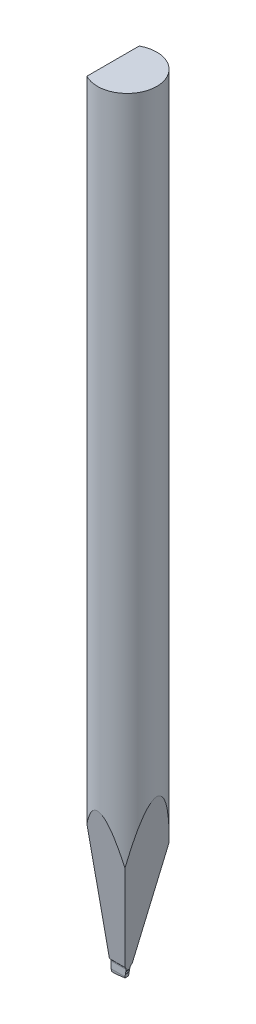
ISO-10303-21;
HEADER;
FILE_DESCRIPTION(('STEP AP214'),'2;1');
FILE_NAME('part.step','',(''),(''),'','','');
FILE_SCHEMA(('AUTOMOTIVE_DESIGN { 1 0 10303 214 1 1 1 1 }'));
ENDSEC;
DATA;
#1=APPLICATION_CONTEXT('core data for automotive mechanical design processes');
#2=APPLICATION_PROTOCOL_DEFINITION('international standard','automotive_design',2000,#1);
#3=PRODUCT_CONTEXT('',#1,'mechanical');
#4=PRODUCT('Part','Part','',(#3));
#5=PRODUCT_RELATED_PRODUCT_CATEGORY('part','',(#4));
#6=PRODUCT_DEFINITION_FORMATION('','',#4);
#7=PRODUCT_DEFINITION_CONTEXT('part definition',#1,'design');
#8=PRODUCT_DEFINITION('design','',#6,#7);
#9=PRODUCT_DEFINITION_SHAPE('','',#8);
#10=(LENGTH_UNIT() NAMED_UNIT(*) SI_UNIT(.MILLI.,.METRE.));
#11=(NAMED_UNIT(*) PLANE_ANGLE_UNIT() SI_UNIT($,.RADIAN.));
#12=(NAMED_UNIT(*) SI_UNIT($,.STERADIAN.) SOLID_ANGLE_UNIT());
#13=UNCERTAINTY_MEASURE_WITH_UNIT(LENGTH_MEASURE(1.E-05),#10,'distance_accuracy_value','');
#14=(GEOMETRIC_REPRESENTATION_CONTEXT(3) GLOBAL_UNCERTAINTY_ASSIGNED_CONTEXT((#13)) GLOBAL_UNIT_ASSIGNED_CONTEXT((#10,
#11,#12)) REPRESENTATION_CONTEXT('',''));
#15=CARTESIAN_POINT('',(0.,0.,0.));
#16=DIRECTION('',(0.,0.,1.));
#17=DIRECTION('',(1.,0.,0.));
#18=AXIS2_PLACEMENT_3D('',#15,#16,#17);
#19=CARTESIAN_POINT('',(26.8738719491216,0.,0.0381));
#20=DIRECTION('',(0.,-0.173648177666931,0.984807753012208));
#21=DIRECTION('',(0.,-0.984807753012208,-0.173648177666931));
#22=AXIS2_PLACEMENT_3D('',#19,#20,#21);
#23=PLANE('',#22);
#24=CARTESIAN_POINT('',(-0.35052,0.0254,0.0425787053099959));
#25=DIRECTION('',(0.,-0.173648177666931,0.984807753012208));
#26=DIRECTION('',(0.,-0.984807753012208,-0.173648177666931));
#27=AXIS2_PLACEMENT_3D('',#24,#25,#26);
#28=ELLIPSE('',#27,0.0257918359418979,0.0254);
#29=CARTESIAN_POINT('',(-0.358859771715365,0.00140816372730878,0.0383482972583795));
#30=VERTEX_POINT('',#29);
#31=CARTESIAN_POINT('',(-0.37592,0.0254,0.0425787053099959));
#32=VERTEX_POINT('',#31);
#33=EDGE_CURVE('E75',#30,#32,#28,.F.);
#34=ORIENTED_EDGE('',*,*,#33,.F.);
#35=DIRECTION('',(-1.,0.,0.));
#36=VECTOR('',#35,1.);
#37=CARTESIAN_POINT('',(26.7468719491216,0.00140816372730878,0.0383482972583795));
#38=LINE('',#37,#36);
#39=CARTESIAN_POINT('',(-0.264300394450547,0.00140816372730954,0.0383482972583797));
#40=VERTEX_POINT('',#39);
#41=EDGE_CURVE('E276',#40,#30,#38,.T.);
#42=ORIENTED_EDGE('',*,*,#41,.F.);
#43=DIRECTION('',(-0.98997002855162,-0.139131214142995,-0.0245325869121374));
#44=VECTOR('',#43,1.);
#45=CARTESIAN_POINT('',(26.3320118858664,3.73927609160853,0.697435263268685));
#46=LINE('',#45,#44);
#47=CARTESIAN_POINT('',(-0.0138656438636779,0.0366044726132731,0.0445543561363242));
#48=VERTEX_POINT('',#47);
#49=EDGE_CURVE('E474',#48,#40,#46,.T.);
#50=ORIENTED_EDGE('',*,*,#49,.F.);
#51=DIRECTION('',(-0.171087869746036,-0.970287525247814,-0.171087869746036));
#52=VECTOR('',#51,1.);
#53=CARTESIAN_POINT('',(0.766901483986011,4.46455489014234,0.825321483986016));
#54=LINE('',#53,#52);
#55=CARTESIAN_POINT('',(-0.00762000000000072,0.072025279109145,0.0508));
#56=VERTEX_POINT('',#55);
#57=EDGE_CURVE('E460',#56,#48,#54,.T.);
#58=ORIENTED_EDGE('',*,*,#57,.F.);
#59=DIRECTION('',(-1.,0.,0.));
#60=VECTOR('',#59,1.);
#61=CARTESIAN_POINT('',(26.8738719491216,0.0720252791091445,0.0508));
#62=LINE('',#61,#60);
#63=CARTESIAN_POINT('',(-0.375919999999998,0.0720252791091445,0.0508));
#64=VERTEX_POINT('',#63);
#65=EDGE_CURVE('E304',#56,#64,#62,.T.);
#66=ORIENTED_EDGE('',*,*,#65,.T.);
#67=DIRECTION('',(0.,0.984807753012208,0.173648177666931));
#68=VECTOR('',#67,1.);
#69=CARTESIAN_POINT('',(-0.37592,20.2532840805181,3.60930043134861));
#70=LINE('',#69,#68);
#71=EDGE_CURVE('E54',#32,#64,#70,.T.);
#72=ORIENTED_EDGE('',*,*,#71,.F.);
#73=EDGE_LOOP('',(#34,#42,#50,#58,#66,#72));
#74=FACE_BOUND('',#73,.T.);
#75=ADVANCED_FACE('F46',(#74),#23,.T.);
#76=CARTESIAN_POINT('',(26.8738719491216,0.,-0.0381));
#77=DIRECTION('',(0.,-0.173648177666931,-0.984807753012208));
#78=DIRECTION('',(0.,0.984807753012208,-0.173648177666931));
#79=AXIS2_PLACEMENT_3D('',#76,#77,#78);
#80=PLANE('',#79);
#81=CARTESIAN_POINT('',(-0.35052,0.0254,-0.0425787053099959));
#82=DIRECTION('',(0.,-0.173648177666931,-0.984807753012208));
#83=DIRECTION('',(0.,0.984807753012208,-0.173648177666931));
#84=AXIS2_PLACEMENT_3D('',#81,#82,#83);
#85=ELLIPSE('',#84,0.0257918359418979,0.0254);
#86=CARTESIAN_POINT('',(-0.37592,0.0254,-0.0425787053099959));
#87=VERTEX_POINT('',#86);
#88=CARTESIAN_POINT('',(-0.358859771715365,0.00140816372730878,-0.0383482972583795));
#89=VERTEX_POINT('',#88);
#90=EDGE_CURVE('E230',#87,#89,#85,.F.);
#91=ORIENTED_EDGE('',*,*,#90,.F.);
#92=DIRECTION('',(0.,-0.984807753012208,0.173648177666931));
#93=VECTOR('',#92,1.);
#94=CARTESIAN_POINT('',(-0.37592,20.5277483982937,-3.65769589581418));
#95=LINE('',#94,#93);
#96=CARTESIAN_POINT('',(-0.375919999999998,0.0720252791091445,-0.0508));
#97=VERTEX_POINT('',#96);
#98=EDGE_CURVE('E223',#97,#87,#95,.T.);
#99=ORIENTED_EDGE('',*,*,#98,.F.);
#100=DIRECTION('',(1.,0.,0.));
#101=VECTOR('',#100,1.);
#102=CARTESIAN_POINT('',(26.8738719491216,0.0720252791091445,-0.0508));
#103=LINE('',#102,#101);
#104=CARTESIAN_POINT('',(-0.00762000000000072,0.072025279109145,-0.0508));
#105=VERTEX_POINT('',#104);
#106=EDGE_CURVE('E293',#97,#105,#103,.T.);
#107=ORIENTED_EDGE('',*,*,#106,.T.);
#108=DIRECTION('',(0.171087869746036,0.970287525247814,-0.171087869746036));
#109=VECTOR('',#108,1.);
#110=CARTESIAN_POINT('',(0.766901483986011,4.46455489014234,-0.825321483986016));
#111=LINE('',#110,#109);
#112=CARTESIAN_POINT('',(-0.0138656438636779,0.0366044726132731,-0.0445543561363242));
#113=VERTEX_POINT('',#112);
#114=EDGE_CURVE('E471',#113,#105,#111,.T.);
#115=ORIENTED_EDGE('',*,*,#114,.F.);
#116=DIRECTION('',(0.98997002855162,0.139131214142995,-0.0245325869121374));
#117=VECTOR('',#116,1.);
#118=CARTESIAN_POINT('',(26.3320118858664,3.73927609160853,-0.697435263268685));
#119=LINE('',#118,#117);
#120=CARTESIAN_POINT('',(-0.264300394450547,0.00140816372730954,-0.0383482972583797));
#121=VERTEX_POINT('',#120);
#122=EDGE_CURVE('E316',#121,#113,#119,.T.);
#123=ORIENTED_EDGE('',*,*,#122,.F.);
#124=DIRECTION('',(-1.,0.,0.));
#125=VECTOR('',#124,1.);
#126=CARTESIAN_POINT('',(26.7468719491216,0.00140816372730878,-0.0383482972583795));
#127=LINE('',#126,#125);
#128=EDGE_CURVE('E274',#89,#121,#127,.F.);
#129=ORIENTED_EDGE('',*,*,#128,.F.);
#130=EDGE_LOOP('',(#91,#99,#107,#115,#123,#129));
#131=FACE_BOUND('',#130,.T.);
#132=ADVANCED_FACE('F409',(#131),#80,.T.);
#133=CARTESIAN_POINT('',(-0.27432,0.,26.5246130622543));
#134=DIRECTION('',(-0.139173100960066,0.99026806874157,0.));
#135=DIRECTION('',(-0.99026806874157,-0.139173100960066,0.));
#136=AXIS2_PLACEMENT_3D('',#133,#134,#135);
#137=PLANE('',#136);
#138=DIRECTION('',(-0.99026806874157,-0.139173100960066,0.));
#139=VECTOR('',#138,1.);
#140=CARTESIAN_POINT('',(-0.27432,0.,0.0253999999999983));
#141=LINE('',#140,#139);
#142=CARTESIAN_POINT('',(-0.145800064,0.018062299081338,0.0253999999999992));
#143=VERTEX_POINT('',#142);
#144=CARTESIAN_POINT('',(-0.254691435266474,0.00275861487165988,0.0254));
#145=VERTEX_POINT('',#144);
#146=EDGE_CURVE('E325',#143,#145,#141,.T.);
#147=ORIENTED_EDGE('',*,*,#146,.F.);
#148=DIRECTION('',(0.,0.,1.));
#149=VECTOR('',#148,1.);
#150=CARTESIAN_POINT('',(-0.145800064,0.018062299081338,26.5246130622543));
#151=LINE('',#150,#149);
#152=CARTESIAN_POINT('',(-0.145800064,0.018062299081338,-0.0253999999999992));
#153=VERTEX_POINT('',#152);
#154=EDGE_CURVE('E326',#153,#143,#151,.T.);
#155=ORIENTED_EDGE('',*,*,#154,.F.);
#156=DIRECTION('',(-0.99026806874157,-0.139173100960066,0.));
#157=VECTOR('',#156,1.);
#158=CARTESIAN_POINT('',(-0.27432,0.,-0.0253999999999983));
#159=LINE('',#158,#157);
#160=CARTESIAN_POINT('',(-0.254691435266474,0.00275861487165988,-0.0254));
#161=VERTEX_POINT('',#160);
#162=EDGE_CURVE('E522',#153,#161,#159,.T.);
#163=ORIENTED_EDGE('',*,*,#162,.T.);
#164=CARTESIAN_POINT('',(-2.43404817183528,-0.30353,0.));
#165=DIRECTION('',(-0.139173100960066,0.99026806874157,0.));
#166=DIRECTION('',(-0.99026806874157,-0.139173100960066,0.));
#167=AXIS2_PLACEMENT_3D('',#164,#165,#166);
#168=ELLIPSE('',#167,2.20832903686027,0.30734);
#169=EDGE_CURVE('E318',#161,#121,#168,.T.);
#170=ORIENTED_EDGE('',*,*,#169,.T.);
#171=ORIENTED_EDGE('',*,*,#122,.T.);
#172=DIRECTION('',(0.,0.,-1.));
#173=VECTOR('',#172,1.);
#174=CARTESIAN_POINT('',(-0.0138656438636759,0.036604472613273,26.5246130622543));
#175=LINE('',#174,#173);
#176=EDGE_CURVE('E518',#48,#113,#175,.T.);
#177=ORIENTED_EDGE('',*,*,#176,.F.);
#178=ORIENTED_EDGE('',*,*,#49,.T.);
#179=EDGE_CURVE('E319',#40,#145,#168,.T.);
#180=ORIENTED_EDGE('',*,*,#179,.T.);
#181=EDGE_LOOP('',(#147,#155,#163,#170,#171,#177,#178,#180));
#182=FACE_BOUND('',#181,.T.);
#183=ADVANCED_FACE('F415',(#182),#137,.F.);
#184=CARTESIAN_POINT('',(26.7468719491216,-0.30353,0.));
#185=DIRECTION('',(-1.,0.,0.));
#186=DIRECTION('',(0.,0.,1.));
#187=AXIS2_PLACEMENT_3D('',#184,#185,#186);
#188=CYLINDRICAL_SURFACE('',#187,0.30734);
#189=ORIENTED_EDGE('',*,*,#41,.T.);
#190=CARTESIAN_POINT('',(-0.358859771715363,0.00140816372730873,0.0383482972583796));
#191=CARTESIAN_POINT('',(-0.360396647488351,0.00199432615121674,0.0337173298004624));
#192=CARTESIAN_POINT('',(-0.36147351316234,0.00248073785254318,0.0289700380222032));
#193=CARTESIAN_POINT('',(-0.362987789534798,0.00324051224325304,0.0193065750394304));
#194=CARTESIAN_POINT('',(-0.363419249543318,0.00351188160533485,0.0143892548600904));
#195=CARTESIAN_POINT('',(-0.363986835986674,0.00386786135229477,0.00288246426424704));
#196=CARTESIAN_POINT('',(-0.363974908576647,0.00385901378714862,-0.00371339132015388));
#197=CARTESIAN_POINT('',(-0.36326280908395,0.00341724251441355,-0.0168407882877219));
#198=CARTESIAN_POINT('',(-0.362566638151256,0.00298678424848865,-0.0233724806493368));
#199=CARTESIAN_POINT('',(-0.36091963214559,0.00222476429987943,-0.0312102512276889));
#200=CARTESIAN_POINT('',(-0.360579988138567,0.00207326607725033,-0.0326588755481361));
#201=CARTESIAN_POINT('',(-0.359801884136851,0.00175299687291753,-0.0355281916951655));
#202=CARTESIAN_POINT('',(-0.359363348735263,0.0015842127642315,-0.0369488613021117));
#203=CARTESIAN_POINT('',(-0.358859771715371,0.00140816372730854,-0.0383482972583811));
#204=B_SPLINE_CURVE_WITH_KNOTS('',3,(#190,#191,#192,#193,#194,#195,#196,#197,#198,#199,#200,
#201,#202,#203),.UNSPECIFIED.,.F.,.F.,(4,2,2,2,2,2,4),(0.,0.0146540828415892,0.0294424621576392,
0.0492025577600988,0.0688477884820969,0.0733315765561583,0.077818795249645),.UNSPECIFIED.);
#205=CARTESIAN_POINT('',(-0.362260077621778,0.00287581548602084,0.0239425280310809));
#206=VERTEX_POINT('',#205);
#207=EDGE_CURVE('E236',#30,#206,#204,.T.);
#208=ORIENTED_EDGE('',*,*,#207,.T.);
#209=CARTESIAN_POINT('',(-0.37592,0.00140816372730878,-0.0383482972583792));
#210=CARTESIAN_POINT('',(-0.363217130576598,0.00300694501534016,-0.0256351009751377));
#211=CARTESIAN_POINT('',(-0.35052,0.00380999999999999,-0.0128161463265759));
#212=CARTESIAN_POINT('',(-0.35052,0.00380999999999997,0.0128161463265762));
#213=CARTESIAN_POINT('',(-0.363217130576598,0.00300694501534011,0.025635100975138));
#214=CARTESIAN_POINT('',(-0.37592,0.00140816372730873,0.0383482972583795));
#215=(BOUNDED_CURVE() B_SPLINE_CURVE(3,(#209,#210,#211,#212,#213,#214),.UNSPECIFIED.,.F.,
.F.) B_SPLINE_CURVE_WITH_KNOTS((4,2,4),(1.44569543911236,1.5707963267949,1.69589721447743),
.UNSPECIFIED.) CURVE() GEOMETRIC_REPRESENTATION_ITEM() RATIONAL_B_SPLINE_CURVE((1.,1.,1.,1.,1.,1.)) REPRESENTATION_ITEM(''));
#216=CARTESIAN_POINT('',(-0.362260346878332,0.00287578452441884,-0.02394292453302));
#217=VERTEX_POINT('',#216);
#218=EDGE_CURVE('E214',#206,#217,#215,.F.);
#219=ORIENTED_EDGE('',*,*,#218,.T.);
#220=EDGE_CURVE('E229',#217,#89,#204,.T.);
#221=ORIENTED_EDGE('',*,*,#220,.T.);
#222=ORIENTED_EDGE('',*,*,#128,.T.);
#223=ORIENTED_EDGE('',*,*,#169,.F.);
#224=DIRECTION('',(-1.,0.,0.));
#225=VECTOR('',#224,1.);
#226=CARTESIAN_POINT('',(26.7468719491216,0.00275861487165988,-0.0254));
#227=LINE('',#226,#225);
#228=CARTESIAN_POINT('',(-0.27701705287362,0.00275861487165889,-0.0254));
#229=VERTEX_POINT('',#228);
#230=EDGE_CURVE('E322',#161,#229,#227,.T.);
#231=ORIENTED_EDGE('',*,*,#230,.T.);
#232=CARTESIAN_POINT('',(-0.277017052875006,0.00275861487165987,0.0254));
#233=CARTESIAN_POINT('',(-0.284442218380963,0.00218353327813892,0.0323346828629024));
#234=CARTESIAN_POINT('',(-0.295721808947173,0.00205890636051981,0.0331150533713508));
#235=CARTESIAN_POINT('',(-0.315237407128583,0.00294829307885841,0.023499836635067));
#236=CARTESIAN_POINT('',(-0.323269473701259,0.00381582760070104,0.0120142630280613));
#237=CARTESIAN_POINT('',(-0.323181572117124,0.00380410097188941,-0.0123105905409841));
#238=CARTESIAN_POINT('',(-0.315154489363352,0.00293776360358423,-0.0236340001899681));
#239=CARTESIAN_POINT('',(-0.295544211471413,0.00204709092987491,-0.0332219444343139));
#240=CARTESIAN_POINT('',(-0.284400902139005,0.00218569918925042,-0.0323085649922618));
#241=CARTESIAN_POINT('',(-0.277017052873619,0.00275861487165989,-0.0254));
#242=(BOUNDED_CURVE() B_SPLINE_CURVE(3,(#232,#233,#234,#235,#236,#237,#238,#239,#240,#241),
.UNSPECIFIED.,.F.,.F.) B_SPLINE_CURVE_WITH_KNOTS((4,2,2,2,4),(0.,2.2052188416809E-05,
4.41043768336174E-05,6.61565652504259E-05,8.82087536672343E-05),
.UNSPECIFIED.) CURVE() GEOMETRIC_REPRESENTATION_ITEM() RATIONAL_B_SPLINE_CURVE((1.,1.,1.,1.,1.,
1.,1.,1.,1.,1.)) REPRESENTATION_ITEM(''));
#243=CARTESIAN_POINT('',(-0.27701705287362,0.00275861487165927,0.0254));
#244=VERTEX_POINT('',#243);
#245=EDGE_CURVE('E328',#229,#244,#242,.F.);
#246=ORIENTED_EDGE('',*,*,#245,.T.);
#247=DIRECTION('',(-1.,0.,0.));
#248=VECTOR('',#247,1.);
#249=CARTESIAN_POINT('',(26.7468719491216,0.00275861487165988,0.0254));
#250=LINE('',#249,#248);
#251=EDGE_CURVE('E329',#145,#244,#250,.T.);
#252=ORIENTED_EDGE('',*,*,#251,.F.);
#253=ORIENTED_EDGE('',*,*,#179,.F.);
#254=EDGE_LOOP('',(#189,#208,#219,#221,#222,#223,#231,#246,#252,#253));
#255=FACE_BOUND('',#254,.T.);
#256=ADVANCED_FACE('F249',(#255),#188,.F.);
#257=CARTESIAN_POINT('',(0.,21.0312,0.));
#258=DIRECTION('',(0.,-1.,0.));
#259=DIRECTION('',(0.,0.,-1.));
#260=AXIS2_PLACEMENT_3D('',#257,#258,#259);
#261=CYLINDRICAL_SURFACE('',#260,0.792479999999998);
#262=CARTESIAN_POINT('',(0.,-0.216075837327433,0.));
#263=DIRECTION('',(0.,-0.173648177666931,0.984807753012208));
#264=DIRECTION('',(0.,-0.984807753012208,-0.173648177666931));
#265=AXIS2_PLACEMENT_3D('',#262,#263,#264);
#266=ELLIPSE('',#265,4.56371043248163,0.792479999999998);
#267=CARTESIAN_POINT('',(0.530396157131957,3.1232665297122,0.588816157131961));
#268=VERTEX_POINT('',#267);
#269=CARTESIAN_POINT('',(-0.37592,3.74046620982329,0.69764511322018));
#270=VERTEX_POINT('',#269);
#271=EDGE_CURVE('E433',#268,#270,#266,.T.);
#272=ORIENTED_EDGE('',*,*,#271,.F.);
#273=CARTESIAN_POINT('',(0.,0.115240446574634,0.));
#274=DIRECTION('',(-0.984807753012208,0.173648177666931,0.));
#275=DIRECTION('',(-0.173648177666931,-0.984807753012208,0.));
#276=AXIS2_PLACEMENT_3D('',#273,#274,#275);
#277=ELLIPSE('',#276,4.56371043248165,0.792479999999998);
#278=CARTESIAN_POINT('',(0.530396157131957,3.1232665297122,-0.588816157131961));
#279=VERTEX_POINT('',#278);
#280=EDGE_CURVE('E437',#268,#279,#277,.T.);
#281=ORIENTED_EDGE('',*,*,#280,.T.);
#282=CARTESIAN_POINT('',(0.,-0.216075837327433,0.));
#283=DIRECTION('',(0.,-0.173648177666931,-0.984807753012208));
#284=DIRECTION('',(0.,-0.984807753012208,0.173648177666931));
#285=AXIS2_PLACEMENT_3D('',#282,#283,#284);
#286=ELLIPSE('',#285,4.56371043248163,0.792479999999998);
#287=CARTESIAN_POINT('',(-0.37592,3.74046620982329,-0.69764511322018));
#288=VERTEX_POINT('',#287);
#289=EDGE_CURVE('E446',#288,#279,#286,.T.);
#290=ORIENTED_EDGE('',*,*,#289,.F.);
#291=DIRECTION('',(0.,-1.,0.));
#292=VECTOR('',#291,1.);
#293=CARTESIAN_POINT('',(-0.37592,21.0312,-0.69764511322018));
#294=LINE('',#293,#292);
#295=CARTESIAN_POINT('',(-0.37592,21.0312,-0.69764511322018));
#296=VERTEX_POINT('',#295);
#297=EDGE_CURVE('E499',#296,#288,#294,.T.);
#298=ORIENTED_EDGE('',*,*,#297,.F.);
#299=CARTESIAN_POINT('',(0.,21.0312,0.));
#300=DIRECTION('',(0.,1.,0.));
#301=DIRECTION('',(0.,0.,1.));
#302=AXIS2_PLACEMENT_3D('',#299,#300,#301);
#303=CIRCLE('',#302,0.792479999999998);
#304=CARTESIAN_POINT('',(-0.37592,21.0312,0.69764511322018));
#305=VERTEX_POINT('',#304);
#306=EDGE_CURVE('E501',#305,#296,#303,.T.);
#307=ORIENTED_EDGE('',*,*,#306,.F.);
#308=DIRECTION('',(0.,-1.,0.));
#309=VECTOR('',#308,1.);
#310=CARTESIAN_POINT('',(-0.37592,21.0312,0.69764511322018));
#311=LINE('',#310,#309);
#312=EDGE_CURVE('E445',#270,#305,#311,.F.);
#313=ORIENTED_EDGE('',*,*,#312,.F.);
#314=EDGE_LOOP('',(#272,#281,#290,#298,#307,#313));
#315=FACE_BOUND('',#314,.T.);
#316=ADVANCED_FACE('F428',(#315),#261,.T.);
#317=CARTESIAN_POINT('',(-0.37592,21.0312,-0.80247998));
#318=DIRECTION('',(-1.,0.,0.));
#319=DIRECTION('',(0.,0.,1.));
#320=AXIS2_PLACEMENT_3D('',#317,#318,#319);
#321=PLANE('',#320);
#322=DIRECTION('',(0.,0.,-1.));
#323=VECTOR('',#322,1.);
#324=CARTESIAN_POINT('',(-0.37592,0.0254,26.4414783757854));
#325=LINE('',#324,#323);
#326=CARTESIAN_POINT('',(-0.37592,0.0253997871086873,0.0131991981129842));
#327=VERTEX_POINT('',#326);
#328=EDGE_CURVE('E68',#32,#327,#325,.T.);
#329=ORIENTED_EDGE('',*,*,#328,.F.);
#330=ORIENTED_EDGE('',*,*,#71,.T.);
#331=DIRECTION('',(0.,1.,0.));
#332=VECTOR('',#331,1.);
#333=CARTESIAN_POINT('',(-0.37592,21.0312,0.0508));
#334=LINE('',#333,#332);
#335=CARTESIAN_POINT('',(-0.375919999999998,0.254,0.0508));
#336=VERTEX_POINT('',#335);
#337=EDGE_CURVE('E447',#64,#336,#334,.T.);
#338=ORIENTED_EDGE('',*,*,#337,.T.);
#339=CARTESIAN_POINT('',(-0.375919999999998,0.254,0.127));
#340=DIRECTION('',(-1.,0.,0.));
#341=DIRECTION('',(0.,0.,1.));
#342=AXIS2_PLACEMENT_3D('',#339,#340,#341);
#343=CIRCLE('',#342,0.0762);
#344=CARTESIAN_POINT('',(-0.375919999999998,0.307881536726415,0.0731184632735852));
#345=VERTEX_POINT('',#344);
#346=EDGE_CURVE('E307',#336,#345,#343,.F.);
#347=ORIENTED_EDGE('',*,*,#346,.T.);
#348=DIRECTION('',(0.,0.707106781186546,0.707106781186549));
#349=VECTOR('',#348,1.);
#350=CARTESIAN_POINT('',(-0.37592,10.2317415467264,9.99697847327358));
#351=LINE('',#350,#349);
#352=CARTESIAN_POINT('',(-0.375919999999998,0.331275963959008,0.0965128905061785));
#353=VERTEX_POINT('',#352);
#354=EDGE_CURVE('E490',#345,#353,#351,.T.);
#355=ORIENTED_EDGE('',*,*,#354,.T.);
#356=EDGE_CURVE('E294',#353,#270,#70,.T.);
#357=ORIENTED_EDGE('',*,*,#356,.T.);
#358=ORIENTED_EDGE('',*,*,#312,.T.);
#359=DIRECTION('',(0.,0.,-1.));
#360=VECTOR('',#359,1.);
#361=CARTESIAN_POINT('',(-0.37592,21.0312,-0.80247998));
#362=LINE('',#361,#360);
#363=EDGE_CURVE('E496',#305,#296,#362,.T.);
#364=ORIENTED_EDGE('',*,*,#363,.T.);
#365=ORIENTED_EDGE('',*,*,#297,.T.);
#366=CARTESIAN_POINT('',(-0.375919999999998,0.331275963959008,-0.0965128905061785));
#367=VERTEX_POINT('',#366);
#368=EDGE_CURVE('E285',#288,#367,#95,.T.);
#369=ORIENTED_EDGE('',*,*,#368,.T.);
#370=DIRECTION('',(0.,-0.707106781186546,0.707106781186549));
#371=VECTOR('',#370,1.);
#372=CARTESIAN_POINT('',(-0.37592,11.0342215267264,-10.7994584532736));
#373=LINE('',#372,#371);
#374=CARTESIAN_POINT('',(-0.375919999999998,0.307881536726415,-0.0731184632735852));
#375=VERTEX_POINT('',#374);
#376=EDGE_CURVE('E487',#367,#375,#373,.T.);
#377=ORIENTED_EDGE('',*,*,#376,.T.);
#378=CARTESIAN_POINT('',(-0.375919999999998,0.254,-0.127));
#379=DIRECTION('',(-1.,0.,0.));
#380=DIRECTION('',(0.,0.,1.));
#381=AXIS2_PLACEMENT_3D('',#378,#379,#380);
#382=CIRCLE('',#381,0.0762);
#383=CARTESIAN_POINT('',(-0.375919999999998,0.254,-0.0508));
#384=VERTEX_POINT('',#383);
#385=EDGE_CURVE('E310',#375,#384,#382,.F.);
#386=ORIENTED_EDGE('',*,*,#385,.T.);
#387=DIRECTION('',(0.,-1.,0.));
#388=VECTOR('',#387,1.);
#389=CARTESIAN_POINT('',(-0.37592,21.0312,-0.0508));
#390=LINE('',#389,#388);
#391=EDGE_CURVE('E485',#384,#97,#390,.T.);
#392=ORIENTED_EDGE('',*,*,#391,.T.);
#393=ORIENTED_EDGE('',*,*,#98,.T.);
#394=CARTESIAN_POINT('',(-0.37592,0.0254,-0.0129582273133977));
#395=VERTEX_POINT('',#394);
#396=EDGE_CURVE('E219',#395,#87,#325,.T.);
#397=ORIENTED_EDGE('',*,*,#396,.F.);
#398=CARTESIAN_POINT('',(-0.37592,0.00140816372730873,0.0383482972583795));
#399=CARTESIAN_POINT('',(-0.37592,0.0155164202504984,0.0272939185694045));
#400=CARTESIAN_POINT('',(-0.37592,0.0292099999999983,0.0138742665485752));
#401=CARTESIAN_POINT('',(-0.37592,0.0292099999999983,-0.0138742665485748));
#402=CARTESIAN_POINT('',(-0.37592,0.0155164202504982,-0.0272939185694025));
#403=CARTESIAN_POINT('',(-0.37592,0.00140816372730878,-0.0383482972583792));
#404=(BOUNDED_CURVE() B_SPLINE_CURVE(3,(#398,#399,#400,#401,#402,#403),.UNSPECIFIED.,.F.,
.F.) B_SPLINE_CURVE_WITH_KNOTS((4,2,4),(1.44569543911236,1.5707963267949,1.69589721447743),
.UNSPECIFIED.) CURVE() GEOMETRIC_REPRESENTATION_ITEM() RATIONAL_B_SPLINE_CURVE((1.,1.,1.,1.,1.,1.)) REPRESENTATION_ITEM(''));
#405=EDGE_CURVE('E208',#395,#327,#404,.F.);
#406=ORIENTED_EDGE('',*,*,#405,.T.);
#407=EDGE_LOOP('',(#329,#330,#338,#347,#355,#357,#358,#364,#365,#369,#377,#386,#392,#393,#397,#406));
#408=FACE_BOUND('',#407,.T.);
#409=ADVANCED_FACE('F220',(#408),#321,.T.);
#410=DIRECTION('',(-0.171087869746036,-0.970287525247814,-0.171087869746036));
#411=VECTOR('',#410,1.);
#412=CARTESIAN_POINT('',(0.766901483986011,4.46455489014234,0.825321483986016));
#413=LINE('',#412,#411);
#414=CARTESIAN_POINT('',(0.0380928905061758,0.331275963959008,0.0965128905061784));
#415=VERTEX_POINT('',#414);
#416=EDGE_CURVE('E430',#268,#415,#413,.T.);
#417=ORIENTED_EDGE('',*,*,#416,.F.);
#418=ORIENTED_EDGE('',*,*,#271,.T.);
#419=ORIENTED_EDGE('',*,*,#356,.F.);
#420=DIRECTION('',(1.,0.,0.));
#421=VECTOR('',#420,1.);
#422=CARTESIAN_POINT('',(26.8738719491216,0.331275963959008,0.0965128905061785));
#423=LINE('',#422,#421);
#424=EDGE_CURVE('E301',#353,#415,#423,.T.);
#425=ORIENTED_EDGE('',*,*,#424,.T.);
#426=EDGE_LOOP('',(#417,#418,#419,#425));
#427=FACE_BOUND('',#426,.T.);
#428=ADVANCED_FACE('F411',(#427),#23,.T.);
#429=DIRECTION('',(0.171087869746036,0.970287525247814,-0.171087869746036));
#430=VECTOR('',#429,1.);
#431=CARTESIAN_POINT('',(0.766901483986011,4.46455489014234,-0.825321483986016));
#432=LINE('',#431,#430);
#433=CARTESIAN_POINT('',(0.0380928905061758,0.331275963959008,-0.0965128905061784));
#434=VERTEX_POINT('',#433);
#435=EDGE_CURVE('E452',#434,#279,#432,.T.);
#436=ORIENTED_EDGE('',*,*,#435,.F.);
#437=DIRECTION('',(-1.,0.,0.));
#438=VECTOR('',#437,1.);
#439=CARTESIAN_POINT('',(26.8738719491216,0.331275963959008,-0.0965128905061785));
#440=LINE('',#439,#438);
#441=EDGE_CURVE('E299',#434,#367,#440,.T.);
#442=ORIENTED_EDGE('',*,*,#441,.T.);
#443=ORIENTED_EDGE('',*,*,#368,.F.);
#444=ORIENTED_EDGE('',*,*,#289,.T.);
#445=EDGE_LOOP('',(#436,#442,#443,#444));
#446=FACE_BOUND('',#445,.T.);
#447=ADVANCED_FACE('F418',(#446),#80,.T.);
#448=CARTESIAN_POINT('',(0.,21.0312,0.));
#449=DIRECTION('',(0.,1.,0.));
#450=DIRECTION('',(0.,0.,1.));
#451=AXIS2_PLACEMENT_3D('',#448,#449,#450);
#452=PLANE('',#451);
#453=ORIENTED_EDGE('',*,*,#306,.T.);
#454=ORIENTED_EDGE('',*,*,#363,.F.);
#455=EDGE_LOOP('',(#453,#454));
#456=FACE_BOUND('',#455,.T.);
#457=ADVANCED_FACE('F426',(#456),#452,.T.);
#458=CARTESIAN_POINT('',(26.8738719491216,0.,-0.0508));
#459=DIRECTION('',(0.,0.,-1.));
#460=DIRECTION('',(-1.,0.,0.));
#461=AXIS2_PLACEMENT_3D('',#458,#459,#460);
#462=PLANE('',#461);
#463=DIRECTION('',(0.173648177666931,0.984807753012208,0.));
#464=VECTOR('',#463,1.);
#465=CARTESIAN_POINT('',(0.790639116266124,4.59917769253332,-0.0508));
#466=LINE('',#465,#464);
#467=CARTESIAN_POINT('',(0.0244670530999518,0.254,-0.0508));
#468=VERTEX_POINT('',#467);
#469=EDGE_CURVE('E468',#105,#468,#466,.T.);
#470=ORIENTED_EDGE('',*,*,#469,.F.);
#471=ORIENTED_EDGE('',*,*,#106,.F.);
#472=ORIENTED_EDGE('',*,*,#391,.F.);
#473=DIRECTION('',(-1.,0.,0.));
#474=VECTOR('',#473,1.);
#475=CARTESIAN_POINT('',(26.8738719491216,0.254,-0.0508));
#476=LINE('',#475,#474);
#477=EDGE_CURVE('E481',#468,#384,#476,.T.);
#478=ORIENTED_EDGE('',*,*,#477,.F.);
#479=EDGE_LOOP('',(#470,#471,#472,#478));
#480=FACE_BOUND('',#479,.T.);
#481=ADVANCED_FACE('F564',(#480),#462,.T.);
#482=CARTESIAN_POINT('',(26.8738719491216,0.307881536726415,-0.0731184632735852));
#483=DIRECTION('',(0.,-0.707106781186549,-0.707106781186546));
#484=DIRECTION('',(0.,0.707106781186546,-0.707106781186549));
#485=AXIS2_PLACEMENT_3D('',#482,#483,#484);
#486=PLANE('',#485);
#487=DIRECTION('',(0.123724030206484,0.701673843159862,-0.701673843159865));
#488=VECTOR('',#487,1.);
#489=CARTESIAN_POINT('',(0.444823295063377,2.63795871281001,-2.40319563935719));
#490=LINE('',#489,#488);
#491=CARTESIAN_POINT('',(0.0339678217868497,0.307881536726415,-0.0731184632735852));
#492=VERTEX_POINT('',#491);
#493=EDGE_CURVE('E463',#492,#434,#490,.T.);
#494=ORIENTED_EDGE('',*,*,#493,.F.);
#495=DIRECTION('',(-1.,0.,0.));
#496=VECTOR('',#495,1.);
#497=CARTESIAN_POINT('',(26.8738719491216,0.307881536726415,-0.0731184632735852));
#498=LINE('',#497,#496);
#499=EDGE_CURVE('E483',#492,#375,#498,.T.);
#500=ORIENTED_EDGE('',*,*,#499,.T.);
#501=ORIENTED_EDGE('',*,*,#376,.F.);
#502=ORIENTED_EDGE('',*,*,#441,.F.);
#503=EDGE_LOOP('',(#494,#500,#501,#502));
#504=FACE_BOUND('',#503,.T.);
#505=ADVANCED_FACE('F567',(#504),#486,.T.);
#506=CARTESIAN_POINT('',(26.8738719491216,0.254,-0.127));
#507=DIRECTION('',(-1.,0.,0.));
#508=DIRECTION('',(0.,0.,1.));
#509=AXIS2_PLACEMENT_3D('',#506,#507,#508);
#510=CYLINDRICAL_SURFACE('',#509,0.0762);
#511=CARTESIAN_POINT('',(0.0244670530999518,0.254,-0.127));
#512=DIRECTION('',(-0.984807753012208,0.173648177666931,0.));
#513=DIRECTION('',(-0.173648177666931,-0.984807753012208,0.));
#514=AXIS2_PLACEMENT_3D('',#511,#512,#513);
#515=ELLIPSE('',#514,0.0773755078256938,0.0762);
#516=EDGE_CURVE('E465',#468,#492,#515,.T.);
#517=ORIENTED_EDGE('',*,*,#516,.F.);
#518=ORIENTED_EDGE('',*,*,#477,.T.);
#519=ORIENTED_EDGE('',*,*,#385,.F.);
#520=ORIENTED_EDGE('',*,*,#499,.F.);
#521=EDGE_LOOP('',(#517,#518,#519,#520));
#522=FACE_BOUND('',#521,.T.);
#523=ADVANCED_FACE('F561',(#522),#510,.F.);
#524=CARTESIAN_POINT('',(26.8738719491216,0.254,0.127));
#525=DIRECTION('',(-1.,0.,0.));
#526=DIRECTION('',(0.,0.,1.));
#527=AXIS2_PLACEMENT_3D('',#524,#525,#526);
#528=CYLINDRICAL_SURFACE('',#527,0.0762);
#529=CARTESIAN_POINT('',(0.0244670530999518,0.254,0.127));
#530=DIRECTION('',(-0.984807753012208,0.173648177666931,0.));
#531=DIRECTION('',(-0.173648177666931,-0.984807753012208,0.));
#532=AXIS2_PLACEMENT_3D('',#529,#530,#531);
#533=ELLIPSE('',#532,0.0773755078256938,0.0762);
#534=CARTESIAN_POINT('',(0.0339678217868489,0.307881536726415,0.0731184632735853));
#535=VERTEX_POINT('',#534);
#536=CARTESIAN_POINT('',(0.0244670530999484,0.254,0.0508));
#537=VERTEX_POINT('',#536);
#538=EDGE_CURVE('E438',#535,#537,#533,.T.);
#539=ORIENTED_EDGE('',*,*,#538,.F.);
#540=DIRECTION('',(-1.,0.,0.));
#541=VECTOR('',#540,1.);
#542=CARTESIAN_POINT('',(26.8738719491216,0.307881536726415,0.0731184632735852));
#543=LINE('',#542,#541);
#544=EDGE_CURVE('E477',#535,#345,#543,.T.);
#545=ORIENTED_EDGE('',*,*,#544,.T.);
#546=ORIENTED_EDGE('',*,*,#346,.F.);
#547=DIRECTION('',(-1.,0.,0.));
#548=VECTOR('',#547,1.);
#549=CARTESIAN_POINT('',(26.8738719491216,0.254,0.0508));
#550=LINE('',#549,#548);
#551=EDGE_CURVE('E479',#537,#336,#550,.T.);
#552=ORIENTED_EDGE('',*,*,#551,.F.);
#553=EDGE_LOOP('',(#539,#545,#546,#552));
#554=FACE_BOUND('',#553,.T.);
#555=ADVANCED_FACE('F514',(#554),#528,.F.);
#556=CARTESIAN_POINT('',(26.8738719491216,0.,0.0508));
#557=DIRECTION('',(0.,0.,1.));
#558=DIRECTION('',(1.,0.,0.));
#559=AXIS2_PLACEMENT_3D('',#556,#557,#558);
#560=PLANE('',#559);
#561=DIRECTION('',(-0.173648177666931,-0.984807753012208,0.));
#562=VECTOR('',#561,1.);
#563=CARTESIAN_POINT('',(0.790639116266124,4.59917769253332,0.0508));
#564=LINE('',#563,#562);
#565=EDGE_CURVE('E453',#537,#56,#564,.T.);
#566=ORIENTED_EDGE('',*,*,#565,.F.);
#567=ORIENTED_EDGE('',*,*,#551,.T.);
#568=ORIENTED_EDGE('',*,*,#337,.F.);
#569=ORIENTED_EDGE('',*,*,#65,.F.);
#570=EDGE_LOOP('',(#566,#567,#568,#569));
#571=FACE_BOUND('',#570,.T.);
#572=ADVANCED_FACE('F508',(#571),#560,.T.);
#573=CARTESIAN_POINT('',(26.8738719491216,0.307881536726415,0.0731184632735852));
#574=DIRECTION('',(0.,-0.707106781186549,0.707106781186546));
#575=DIRECTION('',(0.,-0.707106781186546,-0.707106781186549));
#576=AXIS2_PLACEMENT_3D('',#573,#574,#575);
#577=PLANE('',#576);
#578=DIRECTION('',(-0.123724030206484,-0.701673843159862,-0.701673843159865));
#579=VECTOR('',#578,1.);
#580=CARTESIAN_POINT('',(0.444823295063377,2.63795871281001,2.40319563935719));
#581=LINE('',#580,#579);
#582=EDGE_CURVE('E313',#415,#535,#581,.T.);
#583=ORIENTED_EDGE('',*,*,#582,.F.);
#584=ORIENTED_EDGE('',*,*,#424,.F.);
#585=ORIENTED_EDGE('',*,*,#354,.F.);
#586=ORIENTED_EDGE('',*,*,#544,.F.);
#587=EDGE_LOOP('',(#583,#584,#585,#586));
#588=FACE_BOUND('',#587,.T.);
#589=ADVANCED_FACE('F517',(#588),#577,.T.);
#590=CARTESIAN_POINT('',(-0.0138656438636759,0.036604472613273,26.5246130622543));
#591=DIRECTION('',(-0.984807753012208,0.173648177666931,0.));
#592=DIRECTION('',(-0.173648177666931,-0.984807753012208,0.));
#593=AXIS2_PLACEMENT_3D('',#590,#591,#592);
#594=PLANE('',#593);
#595=CARTESIAN_POINT('',(0.00997913420261825,0.171834928953466,0.));
#596=DIRECTION('',(-0.984807753012208,0.173648177666931,0.));
#597=DIRECTION('',(0.173648177666931,0.984807753012208,0.));
#598=AXIS2_PLACEMENT_3D('',#595,#596,#597);
#599=ELLIPSE('',#598,0.0515734368592615,0.0370444608655554);
#600=CARTESIAN_POINT('',(0.0189347675292495,0.222624849421952,0.));
#601=VERTEX_POINT('',#600);
#602=EDGE_CURVE('E277',#601,#601,#599,.F.);
#603=ORIENTED_EDGE('',*,*,#602,.F.);
#604=EDGE_LOOP('',(#603));
#605=FACE_BOUND('',#604,.T.);
#606=ORIENTED_EDGE('',*,*,#176,.T.);
#607=ORIENTED_EDGE('',*,*,#114,.T.);
#608=ORIENTED_EDGE('',*,*,#469,.T.);
#609=ORIENTED_EDGE('',*,*,#516,.T.);
#610=ORIENTED_EDGE('',*,*,#493,.T.);
#611=ORIENTED_EDGE('',*,*,#435,.T.);
#612=ORIENTED_EDGE('',*,*,#280,.F.);
#613=ORIENTED_EDGE('',*,*,#416,.T.);
#614=ORIENTED_EDGE('',*,*,#582,.T.);
#615=ORIENTED_EDGE('',*,*,#538,.T.);
#616=ORIENTED_EDGE('',*,*,#565,.T.);
#617=ORIENTED_EDGE('',*,*,#57,.T.);
#618=EDGE_LOOP('',(#606,#607,#608,#609,#610,#611,#612,#613,#614,#615,#616,#617));
#619=FACE_BOUND('',#618,.T.);
#620=ADVANCED_FACE('F392',(#605,#619),#594,.F.);
#621=CARTESIAN_POINT('',(-0.145800064,0.0660400000000001,0.0254));
#622=DIRECTION('',(-1.,0.,0.));
#623=DIRECTION('',(0.,0.,1.));
#624=AXIS2_PLACEMENT_3D('',#621,#622,#623);
#625=PLANE('',#624);
#626=ORIENTED_EDGE('',*,*,#154,.T.);
#627=DIRECTION('',(0.,1.,0.));
#628=VECTOR('',#627,1.);
#629=CARTESIAN_POINT('',(-0.145800064,0.0660400000000001,0.0254));
#630=LINE('',#629,#628);
#631=CARTESIAN_POINT('',(-0.145800064,0.0660400000000001,0.0254));
#632=VERTEX_POINT('',#631);
#633=EDGE_CURVE('E536',#143,#632,#630,.T.);
#634=ORIENTED_EDGE('',*,*,#633,.T.);
#635=DIRECTION('',(0.,0.,-1.));
#636=VECTOR('',#635,1.);
#637=CARTESIAN_POINT('',(-0.145800064,0.0660400000000001,0.0254));
#638=LINE('',#637,#636);
#639=CARTESIAN_POINT('',(-0.145800064,0.0660400000000001,0.02286));
#640=VERTEX_POINT('',#639);
#641=EDGE_CURVE('E358',#632,#640,#638,.T.);
#642=ORIENTED_EDGE('',*,*,#641,.T.);
#643=CARTESIAN_POINT('',(-0.145800064,0.0660400000000001,0.));
#644=DIRECTION('',(1.,0.,0.));
#645=DIRECTION('',(0.,1.,0.));
#646=AXIS2_PLACEMENT_3D('',#643,#644,#645);
#647=ELLIPSE('',#646,0.0263964543073496,0.02286);
#648=CARTESIAN_POINT('',(-0.145800064,0.0660400000000001,-0.0228599999999926));
#649=VERTEX_POINT('',#648);
#650=EDGE_CURVE('E535',#649,#640,#647,.F.);
#651=ORIENTED_EDGE('',*,*,#650,.F.);
#652=CARTESIAN_POINT('',(-0.145800064,0.0660400000000001,-0.0254));
#653=VERTEX_POINT('',#652);
#654=EDGE_CURVE('E528',#649,#653,#638,.T.);
#655=ORIENTED_EDGE('',*,*,#654,.T.);
#656=DIRECTION('',(0.,1.,0.));
#657=VECTOR('',#656,1.);
#658=CARTESIAN_POINT('',(-0.145800064,0.0660400000000001,-0.0254));
#659=LINE('',#658,#657);
#660=EDGE_CURVE('E529',#153,#653,#659,.T.);
#661=ORIENTED_EDGE('',*,*,#660,.F.);
#662=EDGE_LOOP('',(#626,#634,#642,#651,#655,#661));
#663=FACE_BOUND('',#662,.T.);
#664=ADVANCED_FACE('F389',(#663),#625,.T.);
#665=CARTESIAN_POINT('',(-0.0179613089676814,0.139847739630775,0.));
#666=DIRECTION('',(0.866025403784441,0.499999999999995,0.));
#667=DIRECTION('',(-0.499999999999995,0.866025403784441,0.));
#668=AXIS2_PLACEMENT_3D('',#665,#666,#667);
#669=CONICAL_SURFACE('',#668,0.02286,0.392699081698725);
#670=CARTESIAN_POINT('',(-0.0179613089676814,0.139847739630775,0.));
#671=DIRECTION('',(0.866025403784441,0.499999999999995,0.));
#672=DIRECTION('',(-0.499999999999995,0.866025403784441,0.));
#673=AXIS2_PLACEMENT_3D('',#670,#671,#672);
#674=CIRCLE('',#673,0.02286);
#675=CARTESIAN_POINT('',(-0.0293913089676813,0.159645080361287,0.));
#676=VERTEX_POINT('',#675);
#677=EDGE_CURVE('E234',#676,#676,#674,.T.);
#678=ORIENTED_EDGE('',*,*,#677,.F.);
#679=EDGE_LOOP('',(#678));
#680=FACE_BOUND('',#679,.T.);
#681=ORIENTED_EDGE('',*,*,#602,.T.);
#682=EDGE_LOOP('',(#681));
#683=FACE_BOUND('',#682,.T.);
#684=ADVANCED_FACE('F258',(#680,#683),#669,.F.);
#685=CARTESIAN_POINT('',(-0.229331108814043,0.0660400000000001,0.));
#686=DIRECTION('',(-0.601815023152052,-0.79863551004729,0.));
#687=DIRECTION('',(0.79863551004729,-0.601815023152052,0.));
#688=AXIS2_PLACEMENT_3D('',#685,#686,#687);
#689=CYLINDRICAL_SURFACE('',#688,0.0254);
#690=DIRECTION('',(-0.601815023152052,-0.79863551004729,0.));
#691=VECTOR('',#690,1.);
#692=CARTESIAN_POINT('',(-0.178012525826945,0.134142059805924,0.0254));
#693=LINE('',#692,#691);
#694=CARTESIAN_POINT('',(-0.229331108814043,0.0660400000000001,0.0254));
#695=VERTEX_POINT('',#694);
#696=EDGE_CURVE('E347',#695,#244,#693,.T.);
#697=ORIENTED_EDGE('',*,*,#696,.T.);
#698=CARTESIAN_POINT('',(-0.277017052873619,0.00275861487165989,-0.0254));
#699=CARTESIAN_POINT('',(-0.284244061303996,0.00955359045548847,-0.0253999999999998));
#700=CARTESIAN_POINT('',(-0.288953502486963,0.0122267813112386,-0.0212067281142526));
#701=CARTESIAN_POINT('',(-0.296456012010526,0.0154316354161662,-0.0120713465751505));
#702=CARTESIAN_POINT('',(-0.2988562452546,0.0159530703106764,-0.00615277010871756));
#703=CARTESIAN_POINT('',(-0.298910186632104,0.0159403631722948,0.00600471766987933));
#704=CARTESIAN_POINT('',(-0.296506419575357,0.0154186083573108,0.0119999269741193));
#705=CARTESIAN_POINT('',(-0.289083310129462,0.0122031663941623,0.0211370572112736));
#706=CARTESIAN_POINT('',(-0.284274428290388,0.00956911542143528,0.0253999999995684));
#707=CARTESIAN_POINT('',(-0.277017052875006,0.00275861487165987,0.0254));
#708=(BOUNDED_CURVE() B_SPLINE_CURVE(3,(#698,#699,#700,#701,#702,#703,#704,#705,#706,#707),
.UNSPECIFIED.,.F.,.F.) B_SPLINE_CURVE_WITH_KNOTS((4,2,2,2,4),(0.,2.2052188416809E-05,
4.41043768336174E-05,6.61565652504259E-05,8.82087536672343E-05),
.UNSPECIFIED.) CURVE() GEOMETRIC_REPRESENTATION_ITEM() RATIONAL_B_SPLINE_CURVE((1.,1.,1.,1.,1.,
1.,1.,1.,1.,1.)) REPRESENTATION_ITEM(''));
#709=EDGE_CURVE('E363',#244,#229,#708,.F.);
#710=ORIENTED_EDGE('',*,*,#709,.T.);
#711=DIRECTION('',(0.601815023152052,0.79863551004729,0.));
#712=VECTOR('',#711,1.);
#713=CARTESIAN_POINT('',(-0.229331108814043,0.0660400000000001,-0.0254));
#714=LINE('',#713,#712);
#715=CARTESIAN_POINT('',(-0.229331108814043,0.0660400000000001,-0.0254));
#716=VERTEX_POINT('',#715);
#717=EDGE_CURVE('E339',#229,#716,#714,.T.);
#718=ORIENTED_EDGE('',*,*,#717,.T.);
#719=CARTESIAN_POINT('',(-0.229331108814043,0.0660400000000001,0.));
#720=DIRECTION('',(0.,-1.,0.));
#721=DIRECTION('',(-1.,0.,0.));
#722=AXIS2_PLACEMENT_3D('',#719,#720,#721);
#723=ELLIPSE('',#722,0.0318042457171683,0.0254);
#724=EDGE_CURVE('E346',#716,#695,#723,.F.);
#725=ORIENTED_EDGE('',*,*,#724,.T.);
#726=EDGE_LOOP('',(#697,#710,#718,#725));
#727=FACE_BOUND('',#726,.T.);
#728=ADVANCED_FACE('F370',(#727),#689,.F.);
#729=CARTESIAN_POINT('',(0.,0.,0.0254));
#730=DIRECTION('',(0.,0.,-1.));
#731=DIRECTION('',(-1.,0.,0.));
#732=AXIS2_PLACEMENT_3D('',#729,#730,#731);
#733=PLANE('',#732);
#734=ORIENTED_EDGE('',*,*,#146,.T.);
#735=ORIENTED_EDGE('',*,*,#251,.T.);
#736=ORIENTED_EDGE('',*,*,#696,.F.);
#737=DIRECTION('',(-1.,0.,0.));
#738=VECTOR('',#737,1.);
#739=CARTESIAN_POINT('',(-0.261135354531211,0.0660400000000001,0.0254));
#740=LINE('',#739,#738);
#741=EDGE_CURVE('E531',#632,#695,#740,.T.);
#742=ORIENTED_EDGE('',*,*,#741,.F.);
#743=ORIENTED_EDGE('',*,*,#633,.F.);
#744=EDGE_LOOP('',(#734,#735,#736,#742,#743));
#745=FACE_BOUND('',#744,.T.);
#746=ADVANCED_FACE('F382',(#745),#733,.T.);
#747=CARTESIAN_POINT('',(0.,0.,-0.0254));
#748=DIRECTION('',(0.,0.,-1.));
#749=DIRECTION('',(-1.,0.,0.));
#750=AXIS2_PLACEMENT_3D('',#747,#748,#749);
#751=PLANE('',#750);
#752=ORIENTED_EDGE('',*,*,#660,.T.);
#753=DIRECTION('',(-1.,0.,0.));
#754=VECTOR('',#753,1.);
#755=CARTESIAN_POINT('',(-0.261135354531211,0.0660400000000001,-0.0254));
#756=LINE('',#755,#754);
#757=EDGE_CURVE('E532',#653,#716,#756,.T.);
#758=ORIENTED_EDGE('',*,*,#757,.T.);
#759=ORIENTED_EDGE('',*,*,#717,.F.);
#760=ORIENTED_EDGE('',*,*,#230,.F.);
#761=ORIENTED_EDGE('',*,*,#162,.F.);
#762=EDGE_LOOP('',(#752,#758,#759,#760,#761));
#763=FACE_BOUND('',#762,.T.);
#764=ADVANCED_FACE('F387',(#763),#751,.F.);
#765=CARTESIAN_POINT('',(-0.261135354531211,0.0660400000000001,0.0254));
#766=DIRECTION('',(0.,-1.,0.));
#767=DIRECTION('',(1.,0.,0.));
#768=AXIS2_PLACEMENT_3D('',#765,#766,#767);
#769=PLANE('',#768);
#770=ORIENTED_EDGE('',*,*,#757,.F.);
#771=ORIENTED_EDGE('',*,*,#654,.F.);
#772=CARTESIAN_POINT('',(-0.145800064,0.0660400000000001,0.));
#773=DIRECTION('',(0.,1.,0.));
#774=DIRECTION('',(1.,0.,0.));
#775=AXIS2_PLACEMENT_3D('',#772,#773,#774);
#776=ELLIPSE('',#775,0.0457200000000004,0.02286);
#777=EDGE_CURVE('E541',#640,#649,#776,.F.);
#778=ORIENTED_EDGE('',*,*,#777,.F.);
#779=ORIENTED_EDGE('',*,*,#641,.F.);
#780=ORIENTED_EDGE('',*,*,#741,.T.);
#781=ORIENTED_EDGE('',*,*,#724,.F.);
#782=EDGE_LOOP('',(#770,#771,#778,#779,#780,#781));
#783=FACE_BOUND('',#782,.T.);
#784=ADVANCED_FACE('F383',(#783),#769,.T.);
#785=CARTESIAN_POINT('',(-0.344177702611886,-0.0484933830537732,0.));
#786=DIRECTION('',(0.866025403784441,0.499999999999995,0.));
#787=DIRECTION('',(-0.499999999999995,0.866025403784441,0.));
#788=AXIS2_PLACEMENT_3D('',#785,#786,#787);
#789=CYLINDRICAL_SURFACE('',#788,0.02286);
#790=ORIENTED_EDGE('',*,*,#650,.T.);
#791=ORIENTED_EDGE('',*,*,#777,.T.);
#792=EDGE_LOOP('',(#790,#791));
#793=FACE_BOUND('',#792,.T.);
#794=ORIENTED_EDGE('',*,*,#677,.T.);
#795=EDGE_LOOP('',(#794));
#796=FACE_BOUND('',#795,.T.);
#797=ADVANCED_FACE('F386',(#793,#796),#789,.F.);
#798=CARTESIAN_POINT('',(-0.277017052873619,0.00275861487165989,-0.0254));
#799=CARTESIAN_POINT('',(-0.284400902139005,0.00218569918925042,-0.0323085649922618));
#800=CARTESIAN_POINT('',(-0.295544211471413,0.00204709092987491,-0.0332219444343139));
#801=CARTESIAN_POINT('',(-0.315154489363352,0.00293776360358423,-0.0236340001899681));
#802=CARTESIAN_POINT('',(-0.323181572117124,0.00380410097188941,-0.0123105905409841));
#803=CARTESIAN_POINT('',(-0.323269473701259,0.00381582760070104,0.0120142630280613));
#804=CARTESIAN_POINT('',(-0.315237407128583,0.00294829307885841,0.023499836635067));
#805=CARTESIAN_POINT('',(-0.295721808947173,0.00205890636051981,0.0331150533713508));
#806=CARTESIAN_POINT('',(-0.284442218380963,0.00218353327813892,0.0323346828629024));
#807=CARTESIAN_POINT('',(-0.277017052875006,0.00275861487165987,0.0254));
#808=CARTESIAN_POINT('',(-0.277017052873619,0.00275861487165989,-0.0254));
#809=CARTESIAN_POINT('',(-0.283243725486525,0.00275963207462393,-0.0254017220133289));
#810=CARTESIAN_POINT('',(-0.290678174034343,0.00300638260555951,-0.0243613316993762));
#811=CARTESIAN_POINT('',(-0.303035158856831,0.00352993418862727,-0.0158571265757962));
#812=CARTESIAN_POINT('',(-0.307993550261386,0.00380807748128634,-0.00816304192019528));
#813=CARTESIAN_POINT('',(-0.308064062226169,0.00381189899869512,0.00796557596497112));
#814=CARTESIAN_POINT('',(-0.30310400655543,0.00353352593241337,0.0157676611282122));
#815=CARTESIAN_POINT('',(-0.290831606778546,0.00301079311169486,0.0242926080205819));
#816=CARTESIAN_POINT('',(-0.283273825963587,0.0027596115581028,0.0254019934724482));
#817=CARTESIAN_POINT('',(-0.277017052875006,0.00275861487165987,0.0254));
#818=CARTESIAN_POINT('',(-0.277017052873619,0.00275861487165989,-0.0254));
#819=CARTESIAN_POINT('',(-0.284244061303996,0.00955359045548847,-0.0253999999999998));
#820=CARTESIAN_POINT('',(-0.288953502486963,0.0122267813112386,-0.0212067281142526));
#821=CARTESIAN_POINT('',(-0.296456012010526,0.0154316354161662,-0.0120713465751505));
#822=CARTESIAN_POINT('',(-0.2988562452546,0.0159530703106764,-0.00615277010871756));
#823=CARTESIAN_POINT('',(-0.298910186632104,0.0159403631722948,0.00600471766987933));
#824=CARTESIAN_POINT('',(-0.296506419575357,0.0154186083573108,0.0119999269741193));
#825=CARTESIAN_POINT('',(-0.289083310129462,0.0122031663941623,0.0211370572112736));
#826=CARTESIAN_POINT('',(-0.284274428290388,0.00956911542143528,0.0253999999995684));
#827=CARTESIAN_POINT('',(-0.277017052875006,0.00275861487165987,0.0254));
#828=(BOUNDED_SURFACE() B_SPLINE_SURFACE(2,3,((#798,#799,#800,#801,#802,#803,#804,#805,#806,
#807),(#808,#809,#810,#811,#812,#813,#814,#815,#816,#817),(#818,#819,#820,#821,#822,#823,#824,
#825,#826,#827)),.UNSPECIFIED.,.F.,.F.,.F.) B_SPLINE_SURFACE_WITH_KNOTS((3,3),(4,2,2,2,4),(0.,
1.),(0.,2.2052188416809E-05,4.41043768336174E-05,6.61565652504259E-05,8.82087536672343E-05),
.UNSPECIFIED.) GEOMETRIC_REPRESENTATION_ITEM() RATIONAL_B_SPLINE_SURFACE(((1.,1.,1.,1.,1.,1.,1.,
1.,1.,1.),(0.735746093465397,0.820659346337715,0.850537441184119,0.889204183352228,
0.894877934309069,0.894990106833232,0.889301816054046,0.850980898528753,0.820976042649495,
0.735746093474283),(1.,1.,1.,1.,1.,1.,1.,1.,1.,1.))) REPRESENTATION_ITEM('') SURFACE());
#829=ORIENTED_EDGE('',*,*,#245,.F.);
#830=ORIENTED_EDGE('',*,*,#709,.F.);
#831=EDGE_LOOP('',(#829,#830));
#832=FACE_BOUND('',#831,.T.);
#833=ADVANCED_FACE('F400',(#832),#828,.T.);
#834=CARTESIAN_POINT('',(-0.37592,0.00140816372730873,0.0383482972583795));
#835=CARTESIAN_POINT('',(-0.363217130576598,0.00300694501534011,0.025635100975138));
#836=CARTESIAN_POINT('',(-0.35052,0.00380999999999997,0.0128161463265762));
#837=CARTESIAN_POINT('',(-0.35052,0.00380999999999999,-0.0128161463265759));
#838=CARTESIAN_POINT('',(-0.363217130576598,0.00300694501534016,-0.0256351009751377));
#839=CARTESIAN_POINT('',(-0.37592,0.00140816372730878,-0.0383482972583792));
#840=CARTESIAN_POINT('',(-0.37592,0.00140816372730873,0.0383482972583795));
#841=CARTESIAN_POINT('',(-0.375920000000034,0.00300729985109121,0.0256322785058569));
#842=CARTESIAN_POINT('',(-0.375919999999998,0.00381000000000036,0.0128161463265761));
#843=CARTESIAN_POINT('',(-0.375919999999998,0.00380999999999992,-0.0128161463265757));
#844=CARTESIAN_POINT('',(-0.375920000000027,0.00300729985109699,-0.0256322785058574));
#845=CARTESIAN_POINT('',(-0.37592,0.00140816372730878,-0.0383482972583792));
#846=CARTESIAN_POINT('',(-0.37592,0.00140816372730873,0.0383482972583795));
#847=CARTESIAN_POINT('',(-0.37592,0.0155164202504984,0.0272939185694045));
#848=CARTESIAN_POINT('',(-0.37592,0.0292099999999983,0.0138742665485752));
#849=CARTESIAN_POINT('',(-0.37592,0.0292099999999983,-0.0138742665485748));
#850=CARTESIAN_POINT('',(-0.37592,0.0155164202504982,-0.0272939185694025));
#851=CARTESIAN_POINT('',(-0.37592,0.00140816372730878,-0.0383482972583792));
#852=(BOUNDED_SURFACE() B_SPLINE_SURFACE(2,3,((#834,#835,#836,#837,#838,#839),(#840,#841,#842,
#843,#844,#845),(#846,#847,#848,#849,#850,#851)),.UNSPECIFIED.,.F.,.F.,
.F.) B_SPLINE_SURFACE_WITH_KNOTS((3,3),(4,2,4),(0.,1.),(1.44569543911236,1.5707963267949,
1.69589721447743),.UNSPECIFIED.) GEOMETRIC_REPRESENTATION_ITEM() RATIONAL_B_SPLINE_SURFACE(((1.,
1.,1.,1.,1.,1.),(0.707106781186548,0.707106781186548,0.707106781186574,0.707106781186574,
0.707106781186548,0.707106781186548),(1.,1.,1.,1.,1.,1.))) REPRESENTATION_ITEM('') SURFACE());
#853=CARTESIAN_POINT('',(-0.362257560457473,0.00287468813776913,-0.0239562139582788));
#854=CARTESIAN_POINT('',(-0.362359424034202,0.0029286253542145,-0.0231904467067408));
#855=CARTESIAN_POINT('',(-0.362594581601946,0.0030505876011278,-0.0224690955786583));
#856=CARTESIAN_POINT('',(-0.363242324420617,0.00341259460634427,-0.0211446053386503));
#857=CARTESIAN_POINT('',(-0.363654332244857,0.00365225543561826,-0.0205410907336218));
#858=CARTESIAN_POINT('',(-0.364849662848005,0.004410726210836,-0.0191487359438978));
#859=CARTESIAN_POINT('',(-0.365705463631869,0.00501056146206298,-0.0184743863224588));
#860=CARTESIAN_POINT('',(-0.368002709251679,0.00687839335345318,-0.016939474072458));
#861=CARTESIAN_POINT('',(-0.369426527031131,0.00831781345144902,-0.0162891171942924));
#862=CARTESIAN_POINT('',(-0.37230869139642,0.0120683302990783,-0.0150633529056373));
#863=CARTESIAN_POINT('',(-0.373631355420595,0.0145109127016015,-0.0145790483244364));
#864=CARTESIAN_POINT('',(-0.375274389818141,0.019267820005942,-0.0138525024739706));
#865=CARTESIAN_POINT('',(-0.375727139260482,0.0215330853068673,-0.0135830768951429));
#866=CARTESIAN_POINT('',(-0.375903623898595,0.0243422668024614,-0.0132912544796635));
#867=CARTESIAN_POINT('',(-0.375920214452519,0.0248712860554432,-0.0132381277538864));
#868=CARTESIAN_POINT('',(-0.37592,0.0254,-0.0131864000368273));
#869=B_SPLINE_CURVE_WITH_KNOTS('',3,(#853,#854,#855,#856,#857,#858,#859,#860,#861,#862,#863,
#864,#865,#866,#867,#868),.UNSPECIFIED.,.F.,.F.,(4,2,2,2,2,2,2,4),(0.,0.00227803602673961,
0.00454869004046217,0.00821661731707541,0.0145005201293434,0.022801946506114,0.0296889104439701,
0.0312836119406718),.UNSPECIFIED.);
#870=EDGE_CURVE('E12',#217,#395,#869,.T.);
#871=CARTESIAN_POINT('',(-0.362257560459389,0.00287468813794154,0.0239562139596329));
#872=CARTESIAN_POINT('',(-0.362359424035627,0.00292862535301252,0.0231904467070401));
#873=CARTESIAN_POINT('',(-0.362594581602716,0.0030505876005266,0.0224690955782196));
#874=CARTESIAN_POINT('',(-0.363242324420409,0.00341259460790476,0.0211446053373499));
#875=CARTESIAN_POINT('',(-0.36365433224427,0.00365225543869979,0.0205410907321605));
#876=CARTESIAN_POINT('',(-0.364849662849209,0.00441072621615669,0.0191487359406465));
#877=CARTESIAN_POINT('',(-0.365705463636576,0.0050105614669878,0.0184743863182851));
#878=CARTESIAN_POINT('',(-0.368002709271434,0.00687839336764799,0.0169394740610388));
#879=CARTESIAN_POINT('',(-0.369426527060298,0.00831781348089137,0.0162891171805989));
#880=CARTESIAN_POINT('',(-0.372308691428212,0.0120683303518132,0.0150633528935819));
#881=CARTESIAN_POINT('',(-0.373631355447708,0.0145109127589925,0.0145790483138781));
#882=CARTESIAN_POINT('',(-0.375274389826837,0.0192678200486957,0.0138525024688748));
#883=CARTESIAN_POINT('',(-0.375727139261737,0.0215330853283799,0.0135830768929039));
#884=CARTESIAN_POINT('',(-0.37590362389853,0.0243422668024634,0.0132912544796596));
#885=CARTESIAN_POINT('',(-0.375920214452475,0.0248712860554445,0.0132381277538823));
#886=CARTESIAN_POINT('',(-0.37592,0.0254,0.0131864000368228));
#887=B_SPLINE_CURVE_WITH_KNOTS('',3,(#871,#872,#873,#874,#875,#876,#877,#878,#879,#880,#881,
#882,#883,#884,#885,#886),.UNSPECIFIED.,.F.,.F.,(4,2,2,2,2,2,2,4),(0.,0.00227803602852885,
0.00454869004333068,0.00821661732799828,0.0145005201892037,0.0228019465714768,
0.0296889104444149,0.0312836119411146),.UNSPECIFIED.);
#888=EDGE_CURVE('E60',#327,#206,#887,.F.);
#889=ORIENTED_EDGE('',*,*,#870,.F.);
#890=ORIENTED_EDGE('',*,*,#218,.F.);
#891=ORIENTED_EDGE('',*,*,#888,.F.);
#892=ORIENTED_EDGE('',*,*,#405,.F.);
#893=EDGE_LOOP('',(#889,#890,#891,#892));
#894=FACE_BOUND('',#893,.T.);
#895=ADVANCED_FACE('F49',(#894),#852,.T.);
#896=CARTESIAN_POINT('',(-0.35052,0.0254,26.4414783757854));
#897=DIRECTION('',(0.,0.,-1.));
#898=DIRECTION('',(-1.,0.,0.));
#899=AXIS2_PLACEMENT_3D('',#896,#897,#898);
#900=CYLINDRICAL_SURFACE('',#899,0.0254);
#901=ORIENTED_EDGE('',*,*,#207,.F.);
#902=ORIENTED_EDGE('',*,*,#33,.T.);
#903=ORIENTED_EDGE('',*,*,#328,.T.);
#904=ORIENTED_EDGE('',*,*,#888,.T.);
#905=EDGE_LOOP('',(#901,#902,#903,#904));
#906=FACE_BOUND('',#905,.T.);
#907=ADVANCED_FACE('F253',(#906),#900,.T.);
#908=ORIENTED_EDGE('',*,*,#396,.T.);
#909=ORIENTED_EDGE('',*,*,#90,.T.);
#910=ORIENTED_EDGE('',*,*,#220,.F.);
#911=ORIENTED_EDGE('',*,*,#870,.T.);
#912=EDGE_LOOP('',(#908,#909,#910,#911));
#913=FACE_BOUND('',#912,.T.);
#914=ADVANCED_FACE('F228',(#913),#900,.T.);
#915=CLOSED_SHELL('',(#75,#132,#183,#256,#316,#409,#428,#447,#457,#481,#505,#523,#555,#572,#589,
#620,#664,#684,#728,#746,#764,#784,#797,#833,#895,#907,#914));
#916=MANIFOLD_SOLID_BREP('B2',#915);
#917=ADVANCED_BREP_SHAPE_REPRESENTATION('',(#18,#916),#14);
#918=SHAPE_DEFINITION_REPRESENTATION(#9,#917);
ENDSEC;
END-ISO-10303-21;
